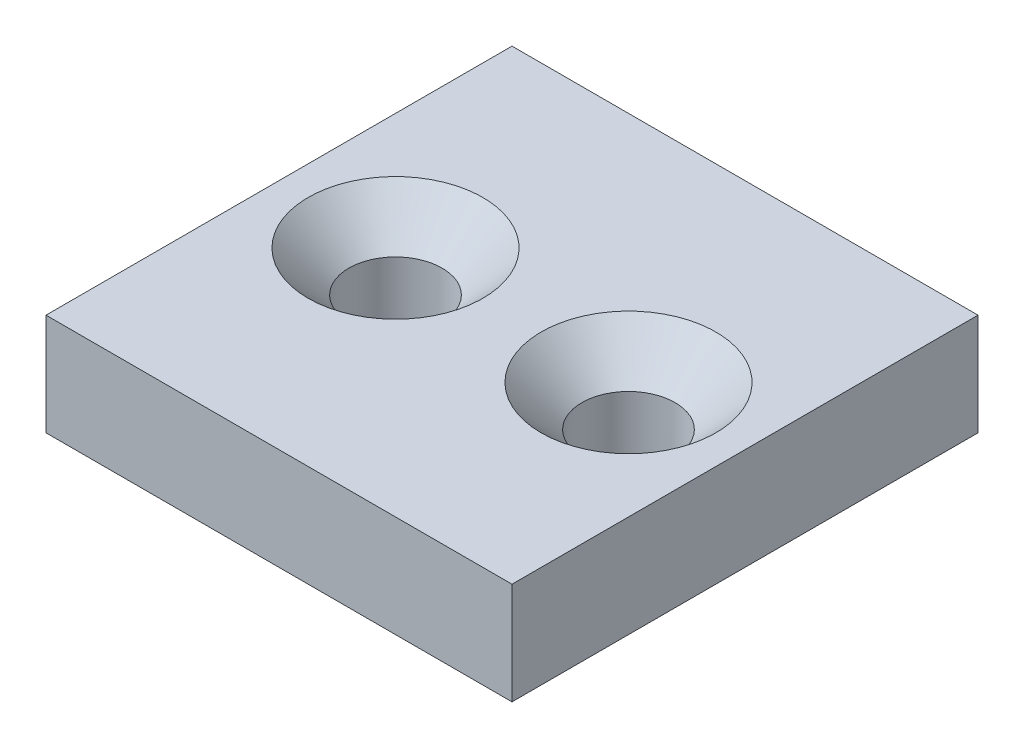
ISO-10303-21;
HEADER;
FILE_DESCRIPTION(('STEP AP214'),'2;1');
FILE_NAME('part.step','',(''),(''),'','','');
FILE_SCHEMA(('AUTOMOTIVE_DESIGN { 1 0 10303 214 1 1 1 1 }'));
ENDSEC;
DATA;
#1=APPLICATION_CONTEXT('core data for automotive mechanical design processes');
#2=APPLICATION_PROTOCOL_DEFINITION('international standard','automotive_design',2000,#1);
#3=PRODUCT_CONTEXT('',#1,'mechanical');
#4=PRODUCT('Part','Part','',(#3));
#5=PRODUCT_RELATED_PRODUCT_CATEGORY('part','',(#4));
#6=PRODUCT_DEFINITION_FORMATION('','',#4);
#7=PRODUCT_DEFINITION_CONTEXT('part definition',#1,'design');
#8=PRODUCT_DEFINITION('design','',#6,#7);
#9=PRODUCT_DEFINITION_SHAPE('','',#8);
#10=(LENGTH_UNIT() NAMED_UNIT(*) SI_UNIT(.MILLI.,.METRE.));
#11=(NAMED_UNIT(*) PLANE_ANGLE_UNIT() SI_UNIT($,.RADIAN.));
#12=(NAMED_UNIT(*) SI_UNIT($,.STERADIAN.) SOLID_ANGLE_UNIT());
#13=UNCERTAINTY_MEASURE_WITH_UNIT(LENGTH_MEASURE(1.E-05),#10,'distance_accuracy_value','');
#14=(GEOMETRIC_REPRESENTATION_CONTEXT(3) GLOBAL_UNCERTAINTY_ASSIGNED_CONTEXT((#13)) GLOBAL_UNIT_ASSIGNED_CONTEXT((#10,
#11,#12)) REPRESENTATION_CONTEXT('',''));
#15=CARTESIAN_POINT('',(0.,0.,0.));
#16=DIRECTION('',(0.,0.,1.));
#17=DIRECTION('',(1.,0.,0.));
#18=AXIS2_PLACEMENT_3D('',#15,#16,#17);
#19=CARTESIAN_POINT('',(0.,7.,0.));
#20=DIRECTION('',(0.,-1.,0.));
#21=DIRECTION('',(0.,0.,-1.));
#22=AXIS2_PLACEMENT_3D('',#19,#20,#21);
#23=PLANE('',#22);
#24=DIRECTION('',(0.,0.,-1.));
#25=VECTOR('',#24,1.);
#26=CARTESIAN_POINT('',(16.,7.,16.));
#27=LINE('',#26,#25);
#28=CARTESIAN_POINT('',(16.,7.,16.));
#29=VERTEX_POINT('',#28);
#30=CARTESIAN_POINT('',(16.,7.,-16.));
#31=VERTEX_POINT('',#30);
#32=EDGE_CURVE('E89',#29,#31,#27,.T.);
#33=ORIENTED_EDGE('',*,*,#32,.T.);
#34=DIRECTION('',(-1.,0.,0.));
#35=VECTOR('',#34,1.);
#36=CARTESIAN_POINT('',(-16.,7.,-16.));
#37=LINE('',#36,#35);
#38=CARTESIAN_POINT('',(-16.,7.,-16.));
#39=VERTEX_POINT('',#38);
#40=EDGE_CURVE('E84',#31,#39,#37,.T.);
#41=ORIENTED_EDGE('',*,*,#40,.T.);
#42=DIRECTION('',(0.,0.,1.));
#43=VECTOR('',#42,1.);
#44=CARTESIAN_POINT('',(-16.,7.,16.));
#45=LINE('',#44,#43);
#46=CARTESIAN_POINT('',(-16.,7.,16.));
#47=VERTEX_POINT('',#46);
#48=EDGE_CURVE('E87',#39,#47,#45,.T.);
#49=ORIENTED_EDGE('',*,*,#48,.T.);
#50=DIRECTION('',(1.,0.,0.));
#51=VECTOR('',#50,1.);
#52=CARTESIAN_POINT('',(-16.,7.,16.));
#53=LINE('',#52,#51);
#54=EDGE_CURVE('E54',#47,#29,#53,.T.);
#55=ORIENTED_EDGE('',*,*,#54,.T.);
#56=EDGE_LOOP('',(#33,#41,#49,#55));
#57=FACE_BOUND('',#56,.T.);
#58=CARTESIAN_POINT('',(-8.,7.,0.));
#59=DIRECTION('',(0.,1.,0.));
#60=DIRECTION('',(0.,0.,1.));
#61=AXIS2_PLACEMENT_3D('',#58,#59,#60);
#62=CIRCLE('',#61,6.);
#63=CARTESIAN_POINT('',(-8.,7.,6.));
#64=VERTEX_POINT('',#63);
#65=EDGE_CURVE('E120',#64,#64,#62,.T.);
#66=ORIENTED_EDGE('',*,*,#65,.F.);
#67=EDGE_LOOP('',(#66));
#68=FACE_BOUND('',#67,.T.);
#69=CARTESIAN_POINT('',(8.,7.,0.));
#70=DIRECTION('',(0.,1.,0.));
#71=DIRECTION('',(0.,0.,1.));
#72=AXIS2_PLACEMENT_3D('',#69,#70,#71);
#73=CIRCLE('',#72,6.);
#74=CARTESIAN_POINT('',(8.,7.,6.));
#75=VERTEX_POINT('',#74);
#76=EDGE_CURVE('E129',#75,#75,#73,.T.);
#77=ORIENTED_EDGE('',*,*,#76,.F.);
#78=EDGE_LOOP('',(#77));
#79=FACE_BOUND('',#78,.T.);
#80=ADVANCED_FACE('F37',(#57,#68,#79),#23,.F.);
#81=CARTESIAN_POINT('',(16.,7.,16.));
#82=DIRECTION('',(-1.,0.,0.));
#83=DIRECTION('',(0.,0.,1.));
#84=AXIS2_PLACEMENT_3D('',#81,#82,#83);
#85=PLANE('',#84);
#86=DIRECTION('',(0.,0.,-1.));
#87=VECTOR('',#86,1.);
#88=CARTESIAN_POINT('',(16.,0.,16.));
#89=LINE('',#88,#87);
#90=CARTESIAN_POINT('',(16.,0.,16.));
#91=VERTEX_POINT('',#90);
#92=CARTESIAN_POINT('',(16.,0.,-16.));
#93=VERTEX_POINT('',#92);
#94=EDGE_CURVE('E101',#91,#93,#89,.T.);
#95=ORIENTED_EDGE('',*,*,#94,.T.);
#96=DIRECTION('',(0.,-1.,0.));
#97=VECTOR('',#96,1.);
#98=CARTESIAN_POINT('',(16.,7.,-16.));
#99=LINE('',#98,#97);
#100=EDGE_CURVE('E11',#31,#93,#99,.T.);
#101=ORIENTED_EDGE('',*,*,#100,.F.);
#102=ORIENTED_EDGE('',*,*,#32,.F.);
#103=DIRECTION('',(0.,-1.,0.));
#104=VECTOR('',#103,1.);
#105=CARTESIAN_POINT('',(16.,7.,16.));
#106=LINE('',#105,#104);
#107=EDGE_CURVE('E97',#29,#91,#106,.T.);
#108=ORIENTED_EDGE('',*,*,#107,.T.);
#109=EDGE_LOOP('',(#95,#101,#102,#108));
#110=FACE_BOUND('',#109,.T.);
#111=ADVANCED_FACE('F39',(#110),#85,.F.);
#112=CARTESIAN_POINT('',(-16.,7.,-16.));
#113=DIRECTION('',(0.,0.,1.));
#114=DIRECTION('',(1.,0.,0.));
#115=AXIS2_PLACEMENT_3D('',#112,#113,#114);
#116=PLANE('',#115);
#117=DIRECTION('',(-1.,0.,0.));
#118=VECTOR('',#117,1.);
#119=CARTESIAN_POINT('',(-16.,0.,-16.));
#120=LINE('',#119,#118);
#121=CARTESIAN_POINT('',(-16.,0.,-16.));
#122=VERTEX_POINT('',#121);
#123=EDGE_CURVE('E93',#93,#122,#120,.T.);
#124=ORIENTED_EDGE('',*,*,#123,.T.);
#125=DIRECTION('',(0.,-1.,0.));
#126=VECTOR('',#125,1.);
#127=CARTESIAN_POINT('',(-16.,7.,-16.));
#128=LINE('',#127,#126);
#129=EDGE_CURVE('E46',#39,#122,#128,.T.);
#130=ORIENTED_EDGE('',*,*,#129,.F.);
#131=ORIENTED_EDGE('',*,*,#40,.F.);
#132=ORIENTED_EDGE('',*,*,#100,.T.);
#133=EDGE_LOOP('',(#124,#130,#131,#132));
#134=FACE_BOUND('',#133,.T.);
#135=ADVANCED_FACE('F92',(#134),#116,.F.);
#136=CARTESIAN_POINT('',(-16.,7.,16.));
#137=DIRECTION('',(1.,0.,0.));
#138=DIRECTION('',(0.,0.,-1.));
#139=AXIS2_PLACEMENT_3D('',#136,#137,#138);
#140=PLANE('',#139);
#141=DIRECTION('',(0.,0.,1.));
#142=VECTOR('',#141,1.);
#143=CARTESIAN_POINT('',(-16.,0.,16.));
#144=LINE('',#143,#142);
#145=CARTESIAN_POINT('',(-16.,0.,16.));
#146=VERTEX_POINT('',#145);
#147=EDGE_CURVE('E71',#122,#146,#144,.T.);
#148=ORIENTED_EDGE('',*,*,#147,.T.);
#149=DIRECTION('',(0.,-1.,0.));
#150=VECTOR('',#149,1.);
#151=CARTESIAN_POINT('',(-16.,7.,16.));
#152=LINE('',#151,#150);
#153=EDGE_CURVE('E94',#47,#146,#152,.T.);
#154=ORIENTED_EDGE('',*,*,#153,.F.);
#155=ORIENTED_EDGE('',*,*,#48,.F.);
#156=ORIENTED_EDGE('',*,*,#129,.T.);
#157=EDGE_LOOP('',(#148,#154,#155,#156));
#158=FACE_BOUND('',#157,.T.);
#159=ADVANCED_FACE('F95',(#158),#140,.F.);
#160=CARTESIAN_POINT('',(-16.,7.,16.));
#161=DIRECTION('',(0.,0.,-1.));
#162=DIRECTION('',(-1.,0.,0.));
#163=AXIS2_PLACEMENT_3D('',#160,#161,#162);
#164=PLANE('',#163);
#165=DIRECTION('',(1.,0.,0.));
#166=VECTOR('',#165,1.);
#167=CARTESIAN_POINT('',(-16.,0.,16.));
#168=LINE('',#167,#166);
#169=EDGE_CURVE('E77',#146,#91,#168,.T.);
#170=ORIENTED_EDGE('',*,*,#169,.T.);
#171=ORIENTED_EDGE('',*,*,#107,.F.);
#172=ORIENTED_EDGE('',*,*,#54,.F.);
#173=ORIENTED_EDGE('',*,*,#153,.T.);
#174=EDGE_LOOP('',(#170,#171,#172,#173));
#175=FACE_BOUND('',#174,.T.);
#176=ADVANCED_FACE('F109',(#175),#164,.F.);
#177=CARTESIAN_POINT('',(0.,0.,0.));
#178=DIRECTION('',(0.,-1.,0.));
#179=DIRECTION('',(0.,0.,-1.));
#180=AXIS2_PLACEMENT_3D('',#177,#178,#179);
#181=PLANE('',#180);
#182=CARTESIAN_POINT('',(8.,0.,0.));
#183=DIRECTION('',(0.,-1.,0.));
#184=DIRECTION('',(0.,0.,-1.));
#185=AXIS2_PLACEMENT_3D('',#182,#183,#184);
#186=CIRCLE('',#185,3.2);
#187=CARTESIAN_POINT('',(8.,0.,-3.2));
#188=VERTEX_POINT('',#187);
#189=EDGE_CURVE('E123',#188,#188,#186,.T.);
#190=ORIENTED_EDGE('',*,*,#189,.F.);
#191=EDGE_LOOP('',(#190));
#192=FACE_BOUND('',#191,.T.);
#193=CARTESIAN_POINT('',(-8.,0.,0.));
#194=DIRECTION('',(0.,-1.,0.));
#195=DIRECTION('',(0.,0.,-1.));
#196=AXIS2_PLACEMENT_3D('',#193,#194,#195);
#197=CIRCLE('',#196,3.2);
#198=CARTESIAN_POINT('',(-8.,0.,-3.2));
#199=VERTEX_POINT('',#198);
#200=EDGE_CURVE('E104',#199,#199,#197,.T.);
#201=ORIENTED_EDGE('',*,*,#200,.F.);
#202=EDGE_LOOP('',(#201));
#203=FACE_BOUND('',#202,.T.);
#204=ORIENTED_EDGE('',*,*,#94,.F.);
#205=ORIENTED_EDGE('',*,*,#169,.F.);
#206=ORIENTED_EDGE('',*,*,#147,.F.);
#207=ORIENTED_EDGE('',*,*,#123,.F.);
#208=EDGE_LOOP('',(#204,#205,#206,#207));
#209=FACE_BOUND('',#208,.T.);
#210=ADVANCED_FACE('F112',(#192,#203,#209),#181,.T.);
#211=CARTESIAN_POINT('',(-8.,7.,0.));
#212=DIRECTION('',(0.,1.,0.));
#213=DIRECTION('',(0.,0.,1.));
#214=AXIS2_PLACEMENT_3D('',#211,#212,#213);
#215=CYLINDRICAL_SURFACE('',#214,3.2);
#216=CARTESIAN_POINT('',(-8.,4.2,0.));
#217=DIRECTION('',(0.,1.,0.));
#218=DIRECTION('',(0.,0.,1.));
#219=AXIS2_PLACEMENT_3D('',#216,#217,#218);
#220=CIRCLE('',#219,3.2);
#221=CARTESIAN_POINT('',(-8.,4.2,3.2));
#222=VERTEX_POINT('',#221);
#223=EDGE_CURVE('E117',#222,#222,#220,.T.);
#224=ORIENTED_EDGE('',*,*,#223,.T.);
#225=EDGE_LOOP('',(#224));
#226=FACE_BOUND('',#225,.T.);
#227=ORIENTED_EDGE('',*,*,#200,.T.);
#228=EDGE_LOOP('',(#227));
#229=FACE_BOUND('',#228,.T.);
#230=ADVANCED_FACE('F142',(#226,#229),#215,.F.);
#231=CARTESIAN_POINT('',(-8.,7.,0.));
#232=DIRECTION('',(0.,1.,0.));
#233=DIRECTION('',(0.,0.,1.));
#234=AXIS2_PLACEMENT_3D('',#231,#232,#233);
#235=CONICAL_SURFACE('',#234,6.,0.785398163397449);
#236=ORIENTED_EDGE('',*,*,#223,.F.);
#237=EDGE_LOOP('',(#236));
#238=FACE_BOUND('',#237,.T.);
#239=ORIENTED_EDGE('',*,*,#65,.T.);
#240=EDGE_LOOP('',(#239));
#241=FACE_BOUND('',#240,.T.);
#242=ADVANCED_FACE('F173',(#238,#241),#235,.F.);
#243=CARTESIAN_POINT('',(8.,7.,0.));
#244=DIRECTION('',(0.,1.,0.));
#245=DIRECTION('',(0.,0.,1.));
#246=AXIS2_PLACEMENT_3D('',#243,#244,#245);
#247=CYLINDRICAL_SURFACE('',#246,3.2);
#248=CARTESIAN_POINT('',(8.,4.2,0.));
#249=DIRECTION('',(0.,1.,0.));
#250=DIRECTION('',(0.,0.,1.));
#251=AXIS2_PLACEMENT_3D('',#248,#249,#250);
#252=CIRCLE('',#251,3.2);
#253=CARTESIAN_POINT('',(8.,4.2,3.2));
#254=VERTEX_POINT('',#253);
#255=EDGE_CURVE('E126',#254,#254,#252,.T.);
#256=ORIENTED_EDGE('',*,*,#255,.T.);
#257=EDGE_LOOP('',(#256));
#258=FACE_BOUND('',#257,.T.);
#259=ORIENTED_EDGE('',*,*,#189,.T.);
#260=EDGE_LOOP('',(#259));
#261=FACE_BOUND('',#260,.T.);
#262=ADVANCED_FACE('F180',(#258,#261),#247,.F.);
#263=CARTESIAN_POINT('',(8.,7.,0.));
#264=DIRECTION('',(0.,1.,0.));
#265=DIRECTION('',(0.,0.,1.));
#266=AXIS2_PLACEMENT_3D('',#263,#264,#265);
#267=CONICAL_SURFACE('',#266,6.,0.785398163397449);
#268=ORIENTED_EDGE('',*,*,#255,.F.);
#269=EDGE_LOOP('',(#268));
#270=FACE_BOUND('',#269,.T.);
#271=ORIENTED_EDGE('',*,*,#76,.T.);
#272=EDGE_LOOP('',(#271));
#273=FACE_BOUND('',#272,.T.);
#274=ADVANCED_FACE('F133',(#270,#273),#267,.F.);
#275=CLOSED_SHELL('',(#80,#111,#135,#159,#176,#210,#230,#242,#262,#274));
#276=MANIFOLD_SOLID_BREP('B2',#275);
#277=ADVANCED_BREP_SHAPE_REPRESENTATION('',(#18,#276),#14);
#278=SHAPE_DEFINITION_REPRESENTATION(#9,#277);
ENDSEC;
END-ISO-10303-21;
